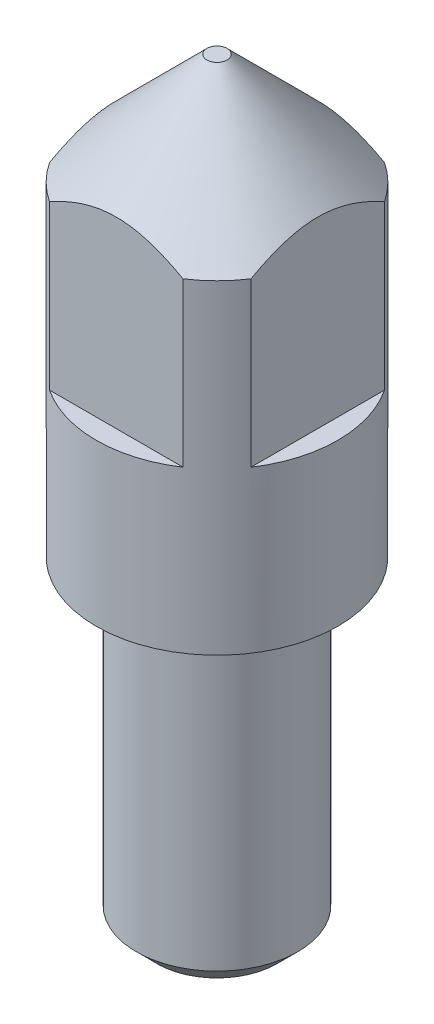
ISO-10303-21;
HEADER;
FILE_DESCRIPTION(('STEP AP214'),'2;1');
FILE_NAME('part.step','',(''),(''),'','','');
FILE_SCHEMA(('AUTOMOTIVE_DESIGN { 1 0 10303 214 1 1 1 1 }'));
ENDSEC;
DATA;
#1=APPLICATION_CONTEXT('core data for automotive mechanical design processes');
#2=APPLICATION_PROTOCOL_DEFINITION('international standard','automotive_design',2000,#1);
#3=PRODUCT_CONTEXT('',#1,'mechanical');
#4=PRODUCT('Part','Part','',(#3));
#5=PRODUCT_RELATED_PRODUCT_CATEGORY('part','',(#4));
#6=PRODUCT_DEFINITION_FORMATION('','',#4);
#7=PRODUCT_DEFINITION_CONTEXT('part definition',#1,'design');
#8=PRODUCT_DEFINITION('design','',#6,#7);
#9=PRODUCT_DEFINITION_SHAPE('','',#8);
#10=(LENGTH_UNIT() NAMED_UNIT(*) SI_UNIT(.MILLI.,.METRE.));
#11=(NAMED_UNIT(*) PLANE_ANGLE_UNIT() SI_UNIT($,.RADIAN.));
#12=(NAMED_UNIT(*) SI_UNIT($,.STERADIAN.) SOLID_ANGLE_UNIT());
#13=UNCERTAINTY_MEASURE_WITH_UNIT(LENGTH_MEASURE(1.E-05),#10,'distance_accuracy_value','');
#14=(GEOMETRIC_REPRESENTATION_CONTEXT(3) GLOBAL_UNCERTAINTY_ASSIGNED_CONTEXT((#13)) GLOBAL_UNIT_ASSIGNED_CONTEXT((#10,
#11,#12)) REPRESENTATION_CONTEXT('',''));
#15=CARTESIAN_POINT('',(0.,0.,0.));
#16=DIRECTION('',(0.,0.,1.));
#17=DIRECTION('',(1.,0.,0.));
#18=AXIS2_PLACEMENT_3D('',#15,#16,#17);
#19=CARTESIAN_POINT('',(0.,-10.5932407644327,0.));
#20=DIRECTION('',(0.,-1.,0.));
#21=DIRECTION('',(0.,0.,-1.));
#22=AXIS2_PLACEMENT_3D('',#19,#20,#21);
#23=CYLINDRICAL_SURFACE('',#22,3.);
#24=CARTESIAN_POINT('',(0.,0.,0.));
#25=DIRECTION('',(0.,-1.,0.));
#26=DIRECTION('',(0.,0.,-1.));
#27=AXIS2_PLACEMENT_3D('',#24,#25,#26);
#28=CIRCLE('',#27,3.);
#29=CARTESIAN_POINT('',(0.,0.,-3.));
#30=VERTEX_POINT('',#29);
#31=EDGE_CURVE('E169',#30,#30,#28,.T.);
#32=ORIENTED_EDGE('',*,*,#31,.F.);
#33=EDGE_LOOP('',(#32));
#34=FACE_BOUND('',#33,.T.);
#35=CARTESIAN_POINT('',(0.,4.,0.));
#36=DIRECTION('',(0.,1.,0.));
#37=DIRECTION('',(0.,0.,1.));
#38=AXIS2_PLACEMENT_3D('',#35,#36,#37);
#39=CIRCLE('',#38,3.);
#40=CARTESIAN_POINT('',(-2.5,4.,1.6583123951777));
#41=VERTEX_POINT('',#40);
#42=CARTESIAN_POINT('',(-2.5,4.,-1.6583123951777));
#43=VERTEX_POINT('',#42);
#44=EDGE_CURVE('E130',#41,#43,#39,.F.);
#45=ORIENTED_EDGE('',*,*,#44,.T.);
#46=DIRECTION('',(0.,-1.,0.));
#47=VECTOR('',#46,1.);
#48=CARTESIAN_POINT('',(-2.5,-10.5932407644327,-1.6583123951777));
#49=LINE('',#48,#47);
#50=CARTESIAN_POINT('',(-2.5,8.05,-1.6583123951777));
#51=VERTEX_POINT('',#50);
#52=EDGE_CURVE('E167',#43,#51,#49,.F.);
#53=ORIENTED_EDGE('',*,*,#52,.T.);
#54=CARTESIAN_POINT('',(0.,8.05,0.));
#55=DIRECTION('',(0.,1.,0.));
#56=DIRECTION('',(0.,0.,1.));
#57=AXIS2_PLACEMENT_3D('',#54,#55,#56);
#58=CIRCLE('',#57,3.);
#59=CARTESIAN_POINT('',(-1.6583123951777,8.05,-2.5));
#60=VERTEX_POINT('',#59);
#61=EDGE_CURVE('E179',#51,#60,#58,.F.);
#62=ORIENTED_EDGE('',*,*,#61,.T.);
#63=DIRECTION('',(0.,-1.,0.));
#64=VECTOR('',#63,1.);
#65=CARTESIAN_POINT('',(-1.6583123951777,-10.5932407644327,-2.5));
#66=LINE('',#65,#64);
#67=CARTESIAN_POINT('',(-1.6583123951777,4.,-2.5));
#68=VERTEX_POINT('',#67);
#69=EDGE_CURVE('E146',#60,#68,#66,.T.);
#70=ORIENTED_EDGE('',*,*,#69,.T.);
#71=CARTESIAN_POINT('',(1.6583123951777,4.,-2.5));
#72=VERTEX_POINT('',#71);
#73=EDGE_CURVE('E132',#68,#72,#39,.F.);
#74=ORIENTED_EDGE('',*,*,#73,.T.);
#75=DIRECTION('',(0.,-1.,0.));
#76=VECTOR('',#75,1.);
#77=CARTESIAN_POINT('',(1.6583123951777,-10.5932407644327,-2.5));
#78=LINE('',#77,#76);
#79=CARTESIAN_POINT('',(1.65831239517877,8.04999999999999,-2.5));
#80=VERTEX_POINT('',#79);
#81=EDGE_CURVE('E143',#72,#80,#78,.F.);
#82=ORIENTED_EDGE('',*,*,#81,.T.);
#83=CARTESIAN_POINT('',(2.5,8.05,-1.6583123951777));
#84=VERTEX_POINT('',#83);
#85=EDGE_CURVE('E327',#80,#84,#58,.F.);
#86=ORIENTED_EDGE('',*,*,#85,.T.);
#87=DIRECTION('',(0.,-1.,0.));
#88=VECTOR('',#87,1.);
#89=CARTESIAN_POINT('',(2.5,-10.5932407644327,-1.6583123951777));
#90=LINE('',#89,#88);
#91=CARTESIAN_POINT('',(2.5,4.,-1.6583123951777));
#92=VERTEX_POINT('',#91);
#93=EDGE_CURVE('E67',#84,#92,#90,.T.);
#94=ORIENTED_EDGE('',*,*,#93,.T.);
#95=CARTESIAN_POINT('',(2.5,4.,1.6583123951777));
#96=VERTEX_POINT('',#95);
#97=EDGE_CURVE('E127',#92,#96,#39,.F.);
#98=ORIENTED_EDGE('',*,*,#97,.T.);
#99=DIRECTION('',(0.,-1.,0.));
#100=VECTOR('',#99,1.);
#101=CARTESIAN_POINT('',(2.5,-10.5932407644327,1.6583123951777));
#102=LINE('',#101,#100);
#103=CARTESIAN_POINT('',(2.5,8.04999999999999,1.65831239517877));
#104=VERTEX_POINT('',#103);
#105=EDGE_CURVE('E160',#96,#104,#102,.F.);
#106=ORIENTED_EDGE('',*,*,#105,.T.);
#107=CARTESIAN_POINT('',(1.6583123951777,8.05,2.5));
#108=VERTEX_POINT('',#107);
#109=EDGE_CURVE('E175',#104,#108,#58,.F.);
#110=ORIENTED_EDGE('',*,*,#109,.T.);
#111=DIRECTION('',(0.,-1.,0.));
#112=VECTOR('',#111,1.);
#113=CARTESIAN_POINT('',(1.6583123951777,-10.5932407644327,2.5));
#114=LINE('',#113,#112);
#115=CARTESIAN_POINT('',(1.6583123951777,4.,2.5));
#116=VERTEX_POINT('',#115);
#117=EDGE_CURVE('E59',#108,#116,#114,.T.);
#118=ORIENTED_EDGE('',*,*,#117,.T.);
#119=CARTESIAN_POINT('',(-1.6583123951777,4.,2.5));
#120=VERTEX_POINT('',#119);
#121=EDGE_CURVE('E121',#116,#120,#39,.F.);
#122=ORIENTED_EDGE('',*,*,#121,.T.);
#123=DIRECTION('',(0.,-1.,0.));
#124=VECTOR('',#123,1.);
#125=CARTESIAN_POINT('',(-1.6583123951777,-10.5932407644327,2.5));
#126=LINE('',#125,#124);
#127=CARTESIAN_POINT('',(-1.6583123951777,8.05,2.5));
#128=VERTEX_POINT('',#127);
#129=EDGE_CURVE('E109',#120,#128,#126,.F.);
#130=ORIENTED_EDGE('',*,*,#129,.T.);
#131=CARTESIAN_POINT('',(-2.5,8.05,1.6583123951777));
#132=VERTEX_POINT('',#131);
#133=EDGE_CURVE('E176',#128,#132,#58,.F.);
#134=ORIENTED_EDGE('',*,*,#133,.T.);
#135=DIRECTION('',(0.,-1.,0.));
#136=VECTOR('',#135,1.);
#137=CARTESIAN_POINT('',(-2.5,-10.5932407644327,1.6583123951777));
#138=LINE('',#137,#136);
#139=EDGE_CURVE('E165',#132,#41,#138,.T.);
#140=ORIENTED_EDGE('',*,*,#139,.T.);
#141=EDGE_LOOP('',(#45,#53,#62,#70,#74,#82,#86,#94,#98,#106,#110,#118,#122,#130,#134,#140));
#142=FACE_BOUND('',#141,.T.);
#143=ADVANCED_FACE('F44',(#34,#142),#23,.T.);
#144=CARTESIAN_POINT('',(0.,8.05,0.));
#145=DIRECTION('',(0.,-1.,0.));
#146=DIRECTION('',(0.,0.,-1.));
#147=AXIS2_PLACEMENT_3D('',#144,#145,#146);
#148=CONICAL_SURFACE('',#147,3.,0.785398163397451);
#149=CARTESIAN_POINT('',(0.,10.8,0.));
#150=DIRECTION('',(0.,1.,0.));
#151=DIRECTION('',(0.,0.,1.));
#152=AXIS2_PLACEMENT_3D('',#149,#150,#151);
#153=CIRCLE('',#152,0.249999999999992);
#154=CARTESIAN_POINT('',(0.,10.8,0.249999999999992));
#155=VERTEX_POINT('',#154);
#156=EDGE_CURVE('E178',#155,#155,#153,.T.);
#157=ORIENTED_EDGE('',*,*,#156,.F.);
#158=EDGE_LOOP('',(#157));
#159=FACE_BOUND('',#158,.T.);
#160=ORIENTED_EDGE('',*,*,#61,.F.);
#161=CARTESIAN_POINT('',(-2.5,5.90097507897142,-4.50138396911145));
#162=CARTESIAN_POINT('',(-2.5,5.99456995632235,-4.39430325156517));
#163=CARTESIAN_POINT('',(-2.5,6.08773940520671,-4.28684647505598));
#164=CARTESIAN_POINT('',(-2.5,6.27299761371148,-4.07097880644586));
#165=CARTESIAN_POINT('',(-2.5,6.36508621366318,-3.96256777741616));
#166=CARTESIAN_POINT('',(-2.5,6.54849209930565,-3.7439452759333));
#167=CARTESIAN_POINT('',(-2.5,6.63980106587162,-3.63372680874483));
#168=CARTESIAN_POINT('',(-2.5,6.82070418974234,-3.4119008736727));
#169=CARTESIAN_POINT('',(-2.5,6.91029846142543,-3.3002934992611));
#170=CARTESIAN_POINT('',(-2.5,7.09421952748106,-3.06656284914948));
#171=CARTESIAN_POINT('',(-2.5,7.18836890811474,-2.94429944170385));
#172=CARTESIAN_POINT('',(-2.5,7.37327003349543,-2.69723292548254));
#173=CARTESIAN_POINT('',(-2.5,7.46402209570703,-2.57243005569927));
#174=CARTESIAN_POINT('',(-2.5,7.64065335129628,-2.31986650194743));
#175=CARTESIAN_POINT('',(-2.5,7.72654414317299,-2.19211397918342));
#176=CARTESIAN_POINT('',(-2.5,7.89177540267915,-1.93246860648654));
#177=CARTESIAN_POINT('',(-2.5,7.97111935714608,-1.80057801282931));
#178=CARTESIAN_POINT('',(-2.5,8.09578210197151,-1.575760380845));
#179=CARTESIAN_POINT('',(-2.5,8.14370815390142,-1.48428701069428));
#180=CARTESIAN_POINT('',(-2.5,8.23402365832711,-1.29858079794464));
#181=CARTESIAN_POINT('',(-2.5,8.27641158067068,-1.20434720147858));
#182=CARTESIAN_POINT('',(-2.5,8.35352950651241,-1.0141085189804));
#183=CARTESIAN_POINT('',(-2.5,8.38834741945518,-0.918139559231198));
#184=CARTESIAN_POINT('',(-2.5,8.44907766790903,-0.723412980689095));
#185=CARTESIAN_POINT('',(-2.5,8.4749951307743,-0.624657003043256));
#186=CARTESIAN_POINT('',(-2.5,8.51058726145075,-0.451417594609877));
#187=CARTESIAN_POINT('',(-2.5,8.52274691090468,-0.377444887644856));
#188=CARTESIAN_POINT('',(-2.5,8.54064282172725,-0.228725870655591));
#189=CARTESIAN_POINT('',(-2.5,8.54638039208316,-0.153979721414888));
#190=CARTESIAN_POINT('',(-2.5,8.55111308274552,-0.00436024457233103));
#191=CARTESIAN_POINT('',(-2.5,8.55011623398272,0.0705128251342809));
#192=CARTESIAN_POINT('',(-2.5,8.54145830342758,0.219875907503066));
#193=CARTESIAN_POINT('',(-2.5,8.53379608940104,0.294365852921961));
#194=CARTESIAN_POINT('',(-2.5,8.50964484531358,0.46001462330832));
#195=CARTESIAN_POINT('',(-2.5,8.49149168603538,0.550930763196928));
#196=CARTESIAN_POINT('',(-2.5,8.44686169967158,0.730707171995754));
#197=CARTESIAN_POINT('',(-2.5,8.42037962998381,0.819566108080841));
#198=CARTESIAN_POINT('',(-2.5,8.36013786256179,0.99616948393199));
#199=CARTESIAN_POINT('',(-2.5,8.32627942098716,1.08387976567212));
#200=CARTESIAN_POINT('',(-2.5,8.2529377277683,1.25685586513446));
#201=CARTESIAN_POINT('',(-2.5,8.21345591783652,1.34212230269655));
#202=CARTESIAN_POINT('',(-2.5,8.10103639624678,1.56901760076816));
#203=CARTESIAN_POINT('',(-2.5,8.0239374373593,1.70857480323458));
#204=CARTESIAN_POINT('',(-2.5,7.861161949913,1.98262955065511));
#205=CARTESIAN_POINT('',(-2.5,7.77547819137404,2.11712269736257));
#206=CARTESIAN_POINT('',(-2.5,7.59783498892176,2.38269014579702));
#207=CARTESIAN_POINT('',(-2.5,7.50585059090447,2.51374762767699));
#208=CARTESIAN_POINT('',(-2.5,7.31769321107805,2.77272707783627));
#209=CARTESIAN_POINT('',(-2.5,7.22152168543914,2.9006501123835));
#210=CARTESIAN_POINT('',(-2.5,7.03461936725198,3.14303876460045));
#211=CARTESIAN_POINT('',(-2.5,6.94414657991833,3.25770425265583));
#212=CARTESIAN_POINT('',(-2.5,6.76120635011357,3.4854477870555));
#213=CARTESIAN_POINT('',(-2.5,6.66873870906762,3.59852567349749));
#214=CARTESIAN_POINT('',(-2.5,6.48312837802375,3.82232891298008));
#215=CARTESIAN_POINT('',(-2.5,6.39000027377423,3.93306639473088));
#216=CARTESIAN_POINT('',(-2.5,6.20252685307669,4.15346812065299));
#217=CARTESIAN_POINT('',(-2.5,6.10818178889873,4.26313257922441));
#218=CARTESIAN_POINT('',(-2.5,6.0133630829043,4.37238052262739));
#219=B_SPLINE_CURVE_WITH_KNOTS('',3,(#161,#162,#163,#164,#165,#166,#167,#168,#169,#170,#171,
#172,#173,#174,#175,#176,#177,#178,#179,#180,#181,#182,#183,#184,#185,#186,#187,#188,#189,#190,
#191,#192,#193,#194,#195,#196,#197,#198,#199,#200,#201,#202,#203,#204,#205,#206,#207,#208,#209,
#210,#211,#212,#213,#214,#215,#216,#217,#218),.UNSPECIFIED.,.F.,.F.,(4,2,2,2,2,2,2,2,2,2,2,2,2,
2,2,2,2,2,2,2,2,2,2,2,2,2,2,2,4),(0.,0.426660980925096,0.853384216644489,1.28275248746833,
1.71209201684616,2.17498768652896,2.63783999210391,3.09953689210781,3.56098628398639,
3.87065059725787,4.18040028881379,4.48633397540434,4.79209112349169,5.01673763076474,
5.2413383408754,5.4656712574238,5.6900422884644,5.96769958678142,6.24553200642928,
6.52734122555814,6.809078324396,7.28688400073095,7.76509551490322,8.24532478904425,
8.72538836597393,9.16354111850517,9.60173768942752,10.0358025447514,10.4697788220927),.UNSPECIFIED.);
#220=EDGE_CURVE('E128',#51,#132,#219,.T.);
#221=ORIENTED_EDGE('',*,*,#220,.T.);
#222=ORIENTED_EDGE('',*,*,#133,.F.);
#223=CARTESIAN_POINT('',(-4.50138396911144,5.90097507897142,2.5));
#224=CARTESIAN_POINT('',(-4.39430325156517,5.99456995632235,2.5));
#225=CARTESIAN_POINT('',(-4.28684647505598,6.08773940520671,2.5));
#226=CARTESIAN_POINT('',(-4.07097880644586,6.27299761371148,2.5));
#227=CARTESIAN_POINT('',(-3.96256777741616,6.36508621366318,2.5));
#228=CARTESIAN_POINT('',(-3.7439452759333,6.54849209930565,2.5));
#229=CARTESIAN_POINT('',(-3.63372680874483,6.63980106587162,2.5));
#230=CARTESIAN_POINT('',(-3.41190087367269,6.82070418974234,2.5));
#231=CARTESIAN_POINT('',(-3.3002934992611,6.91029846142543,2.5));
#232=CARTESIAN_POINT('',(-3.06656284914947,7.09421952748106,2.5));
#233=CARTESIAN_POINT('',(-2.94429944170385,7.18836890811474,2.5));
#234=CARTESIAN_POINT('',(-2.69723292548253,7.37327003349543,2.5));
#235=CARTESIAN_POINT('',(-2.57243005569927,7.46402209570704,2.5));
#236=CARTESIAN_POINT('',(-2.31986650194743,7.64065335129628,2.5));
#237=CARTESIAN_POINT('',(-2.19211397918342,7.72654414317299,2.5));
#238=CARTESIAN_POINT('',(-1.93246860648654,7.89177540267915,2.5));
#239=CARTESIAN_POINT('',(-1.80057801282931,7.97111935714608,2.5));
#240=CARTESIAN_POINT('',(-1.575760380845,8.09578210197151,2.5));
#241=CARTESIAN_POINT('',(-1.48428701069428,8.14370815390142,2.5));
#242=CARTESIAN_POINT('',(-1.29858079794464,8.23402365832711,2.5));
#243=CARTESIAN_POINT('',(-1.20434720147858,8.27641158067068,2.5));
#244=CARTESIAN_POINT('',(-1.0141085189804,8.35352950651241,2.5));
#245=CARTESIAN_POINT('',(-0.918139559231194,8.38834741945518,2.5));
#246=CARTESIAN_POINT('',(-0.723412980689091,8.44907766790903,2.5));
#247=CARTESIAN_POINT('',(-0.624657003043252,8.4749951307743,2.5));
#248=CARTESIAN_POINT('',(-0.451417594609873,8.51058726145076,2.5));
#249=CARTESIAN_POINT('',(-0.377444887644852,8.52274691090468,2.5));
#250=CARTESIAN_POINT('',(-0.228725870655588,8.54064282172725,2.5));
#251=CARTESIAN_POINT('',(-0.153979721414884,8.54638039208316,2.5));
#252=CARTESIAN_POINT('',(-0.00436024457232685,8.55111308274552,2.5));
#253=CARTESIAN_POINT('',(0.0705128251342852,8.55011623398272,2.5));
#254=CARTESIAN_POINT('',(0.219875907503071,8.54145830342758,2.5));
#255=CARTESIAN_POINT('',(0.294365852921966,8.53379608940104,2.5));
#256=CARTESIAN_POINT('',(0.460014623308325,8.50964484531358,2.5));
#257=CARTESIAN_POINT('',(0.550930763196933,8.49149168603538,2.5));
#258=CARTESIAN_POINT('',(0.73070717199576,8.44686169967157,2.5));
#259=CARTESIAN_POINT('',(0.819566108080847,8.42037962998381,2.5));
#260=CARTESIAN_POINT('',(0.996169483931996,8.36013786256178,2.5));
#261=CARTESIAN_POINT('',(1.08387976567213,8.32627942098716,2.5));
#262=CARTESIAN_POINT('',(1.25685586513447,8.2529377277683,2.5));
#263=CARTESIAN_POINT('',(1.34212230269656,8.21345591783652,2.5));
#264=CARTESIAN_POINT('',(1.56901760076817,8.10103639624678,2.5));
#265=CARTESIAN_POINT('',(1.70857480323459,8.0239374373593,2.5));
#266=CARTESIAN_POINT('',(1.98262955065512,7.86116194991299,2.5));
#267=CARTESIAN_POINT('',(2.11712269736259,7.77547819137403,2.5));
#268=CARTESIAN_POINT('',(2.38269014579703,7.59783498892175,2.5));
#269=CARTESIAN_POINT('',(2.513747627677,7.50585059090446,2.5));
#270=CARTESIAN_POINT('',(2.77272707783628,7.31769321107804,2.5));
#271=CARTESIAN_POINT('',(2.90065011238351,7.22152168543913,2.5));
#272=CARTESIAN_POINT('',(3.14303876460046,7.03461936725197,2.5));
#273=CARTESIAN_POINT('',(3.25770425265585,6.94414657991832,2.5));
#274=CARTESIAN_POINT('',(3.48544778705551,6.76120635011356,2.5));
#275=CARTESIAN_POINT('',(3.59852567349751,6.6687387090676,2.5));
#276=CARTESIAN_POINT('',(3.82232891298011,6.48312837802374,2.5));
#277=CARTESIAN_POINT('',(3.93306639473091,6.39000027377421,2.5));
#278=CARTESIAN_POINT('',(4.15346812065301,6.20252685307667,2.5));
#279=CARTESIAN_POINT('',(4.26313257922443,6.10818178889871,2.5));
#280=CARTESIAN_POINT('',(4.37238052262742,6.01336308290428,2.5));
#281=B_SPLINE_CURVE_WITH_KNOTS('',3,(#223,#224,#225,#226,#227,#228,#229,#230,#231,#232,#233,
#234,#235,#236,#237,#238,#239,#240,#241,#242,#243,#244,#245,#246,#247,#248,#249,#250,#251,#252,
#253,#254,#255,#256,#257,#258,#259,#260,#261,#262,#263,#264,#265,#266,#267,#268,#269,#270,#271,
#272,#273,#274,#275,#276,#277,#278,#279,#280),.UNSPECIFIED.,.F.,.F.,(4,2,2,2,2,2,2,2,2,2,2,2,2,
2,2,2,2,2,2,2,2,2,2,2,2,2,2,2,4),(0.,0.426660980925096,0.853384216644489,1.28275248746833,
1.71209201684616,2.17498768652895,2.63783999210391,3.09953689210781,3.56098628398639,
3.87065059725787,4.18040028881379,4.48633397540434,4.7920911234917,5.01673763076474,
5.2413383408754,5.4656712574238,5.6900422884644,5.96769958678143,6.24553200642928,
6.52734122555814,6.809078324396,7.28688400073096,7.76509551490323,8.24532478904427,
8.72538836597396,9.16354111850519,9.60173768942755,10.0358025447515,10.4697788220927),.UNSPECIFIED.);
#282=EDGE_CURVE('E113',#128,#108,#281,.T.);
#283=ORIENTED_EDGE('',*,*,#282,.T.);
#284=ORIENTED_EDGE('',*,*,#109,.F.);
#285=CARTESIAN_POINT('',(2.5,5.90097507897142,-4.50138396911145));
#286=CARTESIAN_POINT('',(2.5,5.99456995632235,-4.39430325156517));
#287=CARTESIAN_POINT('',(2.5,6.08773940520671,-4.28684647505598));
#288=CARTESIAN_POINT('',(2.5,6.27299761371148,-4.07097880644586));
#289=CARTESIAN_POINT('',(2.5,6.36508621366318,-3.96256777741616));
#290=CARTESIAN_POINT('',(2.5,6.54849209930565,-3.7439452759333));
#291=CARTESIAN_POINT('',(2.5,6.63980106587162,-3.63372680874483));
#292=CARTESIAN_POINT('',(2.5,6.82070418974234,-3.4119008736727));
#293=CARTESIAN_POINT('',(2.5,6.91029846142543,-3.3002934992611));
#294=CARTESIAN_POINT('',(2.5,7.09421952748106,-3.06656284914947));
#295=CARTESIAN_POINT('',(2.5,7.18836890811474,-2.94429944170385));
#296=CARTESIAN_POINT('',(2.5,7.37327003349543,-2.69723292548253));
#297=CARTESIAN_POINT('',(2.5,7.46402209570704,-2.57243005569927));
#298=CARTESIAN_POINT('',(2.5,7.64065335129628,-2.31986650194743));
#299=CARTESIAN_POINT('',(2.5,7.72654414317299,-2.19211397918342));
#300=CARTESIAN_POINT('',(2.5,7.89177540267915,-1.93246860648654));
#301=CARTESIAN_POINT('',(2.5,7.97111935714608,-1.80057801282931));
#302=CARTESIAN_POINT('',(2.5,8.09578210197151,-1.575760380845));
#303=CARTESIAN_POINT('',(2.5,8.14370815390142,-1.48428701069428));
#304=CARTESIAN_POINT('',(2.5,8.23402365832711,-1.29858079794464));
#305=CARTESIAN_POINT('',(2.5,8.27641158067068,-1.20434720147858));
#306=CARTESIAN_POINT('',(2.5,8.35352950651241,-1.0141085189804));
#307=CARTESIAN_POINT('',(2.5,8.38834741945518,-0.918139559231196));
#308=CARTESIAN_POINT('',(2.5,8.44907766790903,-0.723412980689092));
#309=CARTESIAN_POINT('',(2.5,8.4749951307743,-0.624657003043254));
#310=CARTESIAN_POINT('',(2.5,8.51058726145076,-0.451417594609875));
#311=CARTESIAN_POINT('',(2.5,8.52274691090468,-0.377444887644854));
#312=CARTESIAN_POINT('',(2.5,8.54064282172725,-0.22872587065559));
#313=CARTESIAN_POINT('',(2.5,8.54638039208316,-0.153979721414886));
#314=CARTESIAN_POINT('',(2.5,8.55111308274552,-0.00436024457232918));
#315=CARTESIAN_POINT('',(2.5,8.55011623398272,0.0705128251342828));
#316=CARTESIAN_POINT('',(2.5,8.54145830342758,0.219875907503068));
#317=CARTESIAN_POINT('',(2.5,8.53379608940104,0.294365852921963));
#318=CARTESIAN_POINT('',(2.5,8.50964484531358,0.460014623308322));
#319=CARTESIAN_POINT('',(2.5,8.49149168603538,0.55093076319693));
#320=CARTESIAN_POINT('',(2.5,8.44686169967157,0.730707171995757));
#321=CARTESIAN_POINT('',(2.5,8.42037962998381,0.819566108080844));
#322=CARTESIAN_POINT('',(2.5,8.36013786256178,0.996169483931992));
#323=CARTESIAN_POINT('',(2.5,8.32627942098716,1.08387976567212));
#324=CARTESIAN_POINT('',(2.5,8.2529377277683,1.25685586513447));
#325=CARTESIAN_POINT('',(2.5,8.21345591783652,1.34212230269656));
#326=CARTESIAN_POINT('',(2.5,8.10103639624678,1.56901760076817));
#327=CARTESIAN_POINT('',(2.5,8.0239374373593,1.70857480323459));
#328=CARTESIAN_POINT('',(2.5,7.86116194991299,1.98262955065512));
#329=CARTESIAN_POINT('',(2.5,7.77547819137403,2.11712269736258));
#330=CARTESIAN_POINT('',(2.5,7.59783498892176,2.38269014579703));
#331=CARTESIAN_POINT('',(2.5,7.50585059090447,2.513747627677));
#332=CARTESIAN_POINT('',(2.5,7.31769321107805,2.77272707783627));
#333=CARTESIAN_POINT('',(2.5,7.22152168543913,2.90065011238351));
#334=CARTESIAN_POINT('',(2.5,7.03461936725197,3.14303876460046));
#335=CARTESIAN_POINT('',(2.5,6.94414657991832,3.25770425265584));
#336=CARTESIAN_POINT('',(2.5,6.76120635011356,3.48544778705551));
#337=CARTESIAN_POINT('',(2.5,6.66873870906761,3.59852567349751));
#338=CARTESIAN_POINT('',(2.5,6.48312837802374,3.8223289129801));
#339=CARTESIAN_POINT('',(2.5,6.39000027377421,3.9330663947309));
#340=CARTESIAN_POINT('',(2.5,6.20252685307667,4.153468120653));
#341=CARTESIAN_POINT('',(2.5,6.10818178889872,4.26313257922442));
#342=CARTESIAN_POINT('',(2.5,6.01336308290429,4.37238052262741));
#343=B_SPLINE_CURVE_WITH_KNOTS('',3,(#285,#286,#287,#288,#289,#290,#291,#292,#293,#294,#295,
#296,#297,#298,#299,#300,#301,#302,#303,#304,#305,#306,#307,#308,#309,#310,#311,#312,#313,#314,
#315,#316,#317,#318,#319,#320,#321,#322,#323,#324,#325,#326,#327,#328,#329,#330,#331,#332,#333,
#334,#335,#336,#337,#338,#339,#340,#341,#342),.UNSPECIFIED.,.F.,.F.,(4,2,2,2,2,2,2,2,2,2,2,2,2,
2,2,2,2,2,2,2,2,2,2,2,2,2,2,2,4),(0.,0.426660980925096,0.853384216644489,1.28275248746833,
1.71209201684616,2.17498768652896,2.63783999210391,3.09953689210781,3.56098628398639,
3.87065059725787,4.18040028881379,4.48633397540434,4.7920911234917,5.01673763076474,
5.2413383408754,5.4656712574238,5.6900422884644,5.96769958678142,6.24553200642928,
6.52734122555814,6.809078324396,7.28688400073095,7.76509551490323,8.24532478904426,
8.72538836597395,9.16354111850518,9.60173768942754,10.0358025447515,10.4697788220927),.UNSPECIFIED.);
#344=EDGE_CURVE('E188',#104,#84,#343,.F.);
#345=ORIENTED_EDGE('',*,*,#344,.T.);
#346=ORIENTED_EDGE('',*,*,#85,.F.);
#347=CARTESIAN_POINT('',(-4.50138396911144,5.90097507897142,-2.5));
#348=CARTESIAN_POINT('',(-4.39430325156517,5.99456995632235,-2.5));
#349=CARTESIAN_POINT('',(-4.28684647505598,6.08773940520671,-2.5));
#350=CARTESIAN_POINT('',(-4.07097880644586,6.27299761371148,-2.5));
#351=CARTESIAN_POINT('',(-3.96256777741616,6.36508621366318,-2.5));
#352=CARTESIAN_POINT('',(-3.7439452759333,6.54849209930565,-2.5));
#353=CARTESIAN_POINT('',(-3.63372680874483,6.63980106587162,-2.5));
#354=CARTESIAN_POINT('',(-3.41190087367269,6.82070418974234,-2.5));
#355=CARTESIAN_POINT('',(-3.3002934992611,6.91029846142543,-2.5));
#356=CARTESIAN_POINT('',(-3.06656284914947,7.09421952748106,-2.5));
#357=CARTESIAN_POINT('',(-2.94429944170385,7.18836890811474,-2.5));
#358=CARTESIAN_POINT('',(-2.69723292548253,7.37327003349543,-2.5));
#359=CARTESIAN_POINT('',(-2.57243005569927,7.46402209570704,-2.5));
#360=CARTESIAN_POINT('',(-2.31986650194743,7.64065335129628,-2.5));
#361=CARTESIAN_POINT('',(-2.19211397918342,7.72654414317299,-2.5));
#362=CARTESIAN_POINT('',(-1.93246860648654,7.89177540267915,-2.5));
#363=CARTESIAN_POINT('',(-1.80057801282931,7.97111935714608,-2.5));
#364=CARTESIAN_POINT('',(-1.575760380845,8.09578210197151,-2.5));
#365=CARTESIAN_POINT('',(-1.48428701069428,8.14370815390142,-2.5));
#366=CARTESIAN_POINT('',(-1.29858079794464,8.23402365832711,-2.5));
#367=CARTESIAN_POINT('',(-1.20434720147858,8.27641158067068,-2.5));
#368=CARTESIAN_POINT('',(-1.0141085189804,8.35352950651241,-2.5));
#369=CARTESIAN_POINT('',(-0.918139559231194,8.38834741945518,-2.5));
#370=CARTESIAN_POINT('',(-0.723412980689091,8.44907766790903,-2.5));
#371=CARTESIAN_POINT('',(-0.624657003043252,8.4749951307743,-2.5));
#372=CARTESIAN_POINT('',(-0.451417594609873,8.51058726145076,-2.5));
#373=CARTESIAN_POINT('',(-0.377444887644852,8.52274691090468,-2.5));
#374=CARTESIAN_POINT('',(-0.228725870655588,8.54064282172725,-2.5));
#375=CARTESIAN_POINT('',(-0.153979721414884,8.54638039208316,-2.5));
#376=CARTESIAN_POINT('',(-0.00436024457232685,8.55111308274552,-2.5));
#377=CARTESIAN_POINT('',(0.0705128251342852,8.55011623398272,-2.5));
#378=CARTESIAN_POINT('',(0.219875907503071,8.54145830342758,-2.5));
#379=CARTESIAN_POINT('',(0.294365852921966,8.53379608940104,-2.5));
#380=CARTESIAN_POINT('',(0.460014623308325,8.50964484531358,-2.5));
#381=CARTESIAN_POINT('',(0.550930763196933,8.49149168603538,-2.5));
#382=CARTESIAN_POINT('',(0.73070717199576,8.44686169967157,-2.5));
#383=CARTESIAN_POINT('',(0.819566108080847,8.42037962998381,-2.5));
#384=CARTESIAN_POINT('',(0.996169483931996,8.36013786256178,-2.5));
#385=CARTESIAN_POINT('',(1.08387976567213,8.32627942098716,-2.5));
#386=CARTESIAN_POINT('',(1.25685586513447,8.2529377277683,-2.5));
#387=CARTESIAN_POINT('',(1.34212230269656,8.21345591783652,-2.5));
#388=CARTESIAN_POINT('',(1.56901760076817,8.10103639624678,-2.5));
#389=CARTESIAN_POINT('',(1.70857480323459,8.0239374373593,-2.5));
#390=CARTESIAN_POINT('',(1.98262955065512,7.86116194991299,-2.5));
#391=CARTESIAN_POINT('',(2.11712269736259,7.77547819137403,-2.5));
#392=CARTESIAN_POINT('',(2.38269014579703,7.59783498892175,-2.5));
#393=CARTESIAN_POINT('',(2.513747627677,7.50585059090446,-2.5));
#394=CARTESIAN_POINT('',(2.77272707783628,7.31769321107804,-2.5));
#395=CARTESIAN_POINT('',(2.90065011238351,7.22152168543913,-2.5));
#396=CARTESIAN_POINT('',(3.14303876460046,7.03461936725197,-2.5));
#397=CARTESIAN_POINT('',(3.25770425265585,6.94414657991832,-2.5));
#398=CARTESIAN_POINT('',(3.48544778705551,6.76120635011356,-2.5));
#399=CARTESIAN_POINT('',(3.59852567349751,6.6687387090676,-2.5));
#400=CARTESIAN_POINT('',(3.82232891298011,6.48312837802374,-2.5));
#401=CARTESIAN_POINT('',(3.93306639473091,6.39000027377421,-2.5));
#402=CARTESIAN_POINT('',(4.15346812065301,6.20252685307667,-2.5));
#403=CARTESIAN_POINT('',(4.26313257922443,6.10818178889871,-2.5));
#404=CARTESIAN_POINT('',(4.37238052262742,6.01336308290428,-2.5));
#405=B_SPLINE_CURVE_WITH_KNOTS('',3,(#347,#348,#349,#350,#351,#352,#353,#354,#355,#356,#357,
#358,#359,#360,#361,#362,#363,#364,#365,#366,#367,#368,#369,#370,#371,#372,#373,#374,#375,#376,
#377,#378,#379,#380,#381,#382,#383,#384,#385,#386,#387,#388,#389,#390,#391,#392,#393,#394,#395,
#396,#397,#398,#399,#400,#401,#402,#403,#404),.UNSPECIFIED.,.F.,.F.,(4,2,2,2,2,2,2,2,2,2,2,2,2,
2,2,2,2,2,2,2,2,2,2,2,2,2,2,2,4),(0.,0.426660980925096,0.853384216644489,1.28275248746833,
1.71209201684616,2.17498768652895,2.63783999210391,3.09953689210781,3.56098628398639,
3.87065059725787,4.18040028881379,4.48633397540434,4.7920911234917,5.01673763076474,
5.2413383408754,5.4656712574238,5.6900422884644,5.96769958678143,6.24553200642928,
6.52734122555814,6.809078324396,7.28688400073096,7.76509551490323,8.24532478904427,
8.72538836597396,9.16354111850519,9.60173768942755,10.0358025447515,10.4697788220927),.UNSPECIFIED.);
#406=EDGE_CURVE('E134',#80,#60,#405,.F.);
#407=ORIENTED_EDGE('',*,*,#406,.T.);
#408=EDGE_LOOP('',(#160,#221,#222,#283,#284,#345,#346,#407));
#409=FACE_BOUND('',#408,.T.);
#410=ADVANCED_FACE('F195',(#159,#409),#148,.T.);
#411=CARTESIAN_POINT('',(0.,-8.,0.));
#412=DIRECTION('',(0.,-1.,0.));
#413=DIRECTION('',(0.,0.,-1.));
#414=AXIS2_PLACEMENT_3D('',#411,#412,#413);
#415=PLANE('',#414);
#416=CARTESIAN_POINT('',(0.,-8.,0.));
#417=DIRECTION('',(0.,-1.,0.));
#418=DIRECTION('',(0.,0.,-1.));
#419=AXIS2_PLACEMENT_3D('',#416,#417,#418);
#420=CIRCLE('',#419,1.5);
#421=CARTESIAN_POINT('',(0.,-8.,-1.5));
#422=VERTEX_POINT('',#421);
#423=EDGE_CURVE('E52',#422,#422,#420,.T.);
#424=ORIENTED_EDGE('',*,*,#423,.T.);
#425=EDGE_LOOP('',(#424));
#426=FACE_BOUND('',#425,.T.);
#427=ADVANCED_FACE('F235',(#426),#415,.T.);
#428=CARTESIAN_POINT('',(0.,-10.5932407644327,0.));
#429=DIRECTION('',(0.,-1.,0.));
#430=DIRECTION('',(0.,0.,-1.));
#431=AXIS2_PLACEMENT_3D('',#428,#429,#430);
#432=CYLINDRICAL_SURFACE('',#431,2.);
#433=CARTESIAN_POINT('',(0.,-7.5,0.));
#434=DIRECTION('',(0.,-1.,0.));
#435=DIRECTION('',(0.,0.,-1.));
#436=AXIS2_PLACEMENT_3D('',#433,#434,#435);
#437=CIRCLE('',#436,2.);
#438=CARTESIAN_POINT('',(0.,-7.5,-2.));
#439=VERTEX_POINT('',#438);
#440=EDGE_CURVE('E12',#439,#439,#437,.F.);
#441=ORIENTED_EDGE('',*,*,#440,.T.);
#442=EDGE_LOOP('',(#441));
#443=FACE_BOUND('',#442,.T.);
#444=CARTESIAN_POINT('',(0.,0.,0.));
#445=DIRECTION('',(0.,-1.,0.));
#446=DIRECTION('',(0.,0.,-1.));
#447=AXIS2_PLACEMENT_3D('',#444,#445,#446);
#448=CIRCLE('',#447,2.);
#449=CARTESIAN_POINT('',(0.,0.,-2.));
#450=VERTEX_POINT('',#449);
#451=EDGE_CURVE('E172',#450,#450,#448,.T.);
#452=ORIENTED_EDGE('',*,*,#451,.T.);
#453=EDGE_LOOP('',(#452));
#454=FACE_BOUND('',#453,.T.);
#455=ADVANCED_FACE('F242',(#443,#454),#432,.T.);
#456=CARTESIAN_POINT('',(2.,0.,0.));
#457=DIRECTION('',(0.,-1.,0.));
#458=DIRECTION('',(0.,0.,-1.));
#459=AXIS2_PLACEMENT_3D('',#456,#457,#458);
#460=PLANE('',#459);
#461=ORIENTED_EDGE('',*,*,#31,.T.);
#462=EDGE_LOOP('',(#461));
#463=FACE_BOUND('',#462,.T.);
#464=ORIENTED_EDGE('',*,*,#451,.F.);
#465=EDGE_LOOP('',(#464));
#466=FACE_BOUND('',#465,.T.);
#467=ADVANCED_FACE('F239',(#463,#466),#460,.T.);
#468=CARTESIAN_POINT('',(3.,10.8,0.));
#469=DIRECTION('',(0.,1.,0.));
#470=DIRECTION('',(0.,0.,1.));
#471=AXIS2_PLACEMENT_3D('',#468,#469,#470);
#472=PLANE('',#471);
#473=ORIENTED_EDGE('',*,*,#156,.T.);
#474=EDGE_LOOP('',(#473));
#475=FACE_BOUND('',#474,.T.);
#476=ADVANCED_FACE('F201',(#475),#472,.T.);
#477=CARTESIAN_POINT('',(-2.5,4.,2.5));
#478=DIRECTION('',(0.,0.,1.));
#479=DIRECTION('',(1.,0.,0.));
#480=AXIS2_PLACEMENT_3D('',#477,#478,#479);
#481=PLANE('',#480);
#482=DIRECTION('',(1.,0.,0.));
#483=VECTOR('',#482,1.);
#484=CARTESIAN_POINT('',(-2.5,4.,2.5));
#485=LINE('',#484,#483);
#486=EDGE_CURVE('E112',#120,#116,#485,.T.);
#487=ORIENTED_EDGE('',*,*,#486,.T.);
#488=ORIENTED_EDGE('',*,*,#117,.F.);
#489=ORIENTED_EDGE('',*,*,#282,.F.);
#490=ORIENTED_EDGE('',*,*,#129,.F.);
#491=EDGE_LOOP('',(#487,#488,#489,#490));
#492=FACE_BOUND('',#491,.T.);
#493=ADVANCED_FACE('F111',(#492),#481,.T.);
#494=CARTESIAN_POINT('',(0.0081611125949798,4.,-0.0304028062235446));
#495=DIRECTION('',(0.,1.,0.));
#496=DIRECTION('',(0.,0.,1.));
#497=AXIS2_PLACEMENT_3D('',#494,#495,#496);
#498=PLANE('',#497);
#499=ORIENTED_EDGE('',*,*,#486,.F.);
#500=ORIENTED_EDGE('',*,*,#121,.F.);
#501=EDGE_LOOP('',(#499,#500));
#502=FACE_BOUND('',#501,.T.);
#503=ADVANCED_FACE('F120',(#502),#498,.T.);
#504=CARTESIAN_POINT('',(2.5,4.,-2.5));
#505=DIRECTION('',(1.,0.,0.));
#506=DIRECTION('',(0.,0.,-1.));
#507=AXIS2_PLACEMENT_3D('',#504,#505,#506);
#508=PLANE('',#507);
#509=DIRECTION('',(0.,0.,-1.));
#510=VECTOR('',#509,1.);
#511=CARTESIAN_POINT('',(2.5,4.,-2.5));
#512=LINE('',#511,#510);
#513=EDGE_CURVE('E122',#96,#92,#512,.T.);
#514=ORIENTED_EDGE('',*,*,#513,.T.);
#515=ORIENTED_EDGE('',*,*,#93,.F.);
#516=ORIENTED_EDGE('',*,*,#344,.F.);
#517=ORIENTED_EDGE('',*,*,#105,.F.);
#518=EDGE_LOOP('',(#514,#515,#516,#517));
#519=FACE_BOUND('',#518,.T.);
#520=ADVANCED_FACE('F202',(#519),#508,.T.);
#521=ORIENTED_EDGE('',*,*,#513,.F.);
#522=ORIENTED_EDGE('',*,*,#97,.F.);
#523=EDGE_LOOP('',(#521,#522));
#524=FACE_BOUND('',#523,.T.);
#525=ADVANCED_FACE('F222',(#524),#498,.T.);
#526=CARTESIAN_POINT('',(-2.5,4.,-2.5));
#527=DIRECTION('',(0.,0.,-1.));
#528=DIRECTION('',(-1.,0.,0.));
#529=AXIS2_PLACEMENT_3D('',#526,#527,#528);
#530=PLANE('',#529);
#531=DIRECTION('',(-1.,0.,0.));
#532=VECTOR('',#531,1.);
#533=CARTESIAN_POINT('',(-2.5,4.,-2.5));
#534=LINE('',#533,#532);
#535=EDGE_CURVE('E151',#72,#68,#534,.T.);
#536=ORIENTED_EDGE('',*,*,#535,.T.);
#537=ORIENTED_EDGE('',*,*,#69,.F.);
#538=ORIENTED_EDGE('',*,*,#406,.F.);
#539=ORIENTED_EDGE('',*,*,#81,.F.);
#540=EDGE_LOOP('',(#536,#537,#538,#539));
#541=FACE_BOUND('',#540,.T.);
#542=ADVANCED_FACE('F153',(#541),#530,.T.);
#543=ORIENTED_EDGE('',*,*,#535,.F.);
#544=ORIENTED_EDGE('',*,*,#73,.F.);
#545=EDGE_LOOP('',(#543,#544));
#546=FACE_BOUND('',#545,.T.);
#547=ADVANCED_FACE('F150',(#546),#498,.T.);
#548=DIRECTION('',(0.,0.,1.));
#549=VECTOR('',#548,1.);
#550=CARTESIAN_POINT('',(-2.5,4.,-2.5));
#551=LINE('',#550,#549);
#552=EDGE_CURVE('E123',#43,#41,#551,.T.);
#553=ORIENTED_EDGE('',*,*,#552,.F.);
#554=ORIENTED_EDGE('',*,*,#44,.F.);
#555=EDGE_LOOP('',(#553,#554));
#556=FACE_BOUND('',#555,.T.);
#557=ADVANCED_FACE('F209',(#556),#498,.T.);
#558=CARTESIAN_POINT('',(-2.5,4.,-2.5));
#559=DIRECTION('',(-1.,0.,0.));
#560=DIRECTION('',(0.,0.,1.));
#561=AXIS2_PLACEMENT_3D('',#558,#559,#560);
#562=PLANE('',#561);
#563=ORIENTED_EDGE('',*,*,#552,.T.);
#564=ORIENTED_EDGE('',*,*,#139,.F.);
#565=ORIENTED_EDGE('',*,*,#220,.F.);
#566=ORIENTED_EDGE('',*,*,#52,.F.);
#567=EDGE_LOOP('',(#563,#564,#565,#566));
#568=FACE_BOUND('',#567,.T.);
#569=ADVANCED_FACE('F205',(#568),#562,.T.);
#570=CARTESIAN_POINT('',(0.,-8.,0.));
#571=DIRECTION('',(0.,1.,0.));
#572=DIRECTION('',(0.,0.,1.));
#573=AXIS2_PLACEMENT_3D('',#570,#571,#572);
#574=CONICAL_SURFACE('',#573,1.5,0.785398163397448);
#575=ORIENTED_EDGE('',*,*,#440,.F.);
#576=EDGE_LOOP('',(#575));
#577=FACE_BOUND('',#576,.T.);
#578=ORIENTED_EDGE('',*,*,#423,.F.);
#579=EDGE_LOOP('',(#578));
#580=FACE_BOUND('',#579,.T.);
#581=ADVANCED_FACE('F46',(#577,#580),#574,.T.);
#582=CLOSED_SHELL('',(#143,#410,#427,#455,#467,#476,#493,#503,#520,#525,#542,#547,#557,#569,#581));
#583=MANIFOLD_SOLID_BREP('B2',#582);
#584=ADVANCED_BREP_SHAPE_REPRESENTATION('',(#18,#583),#14);
#585=SHAPE_DEFINITION_REPRESENTATION(#9,#584);
ENDSEC;
END-ISO-10303-21;
